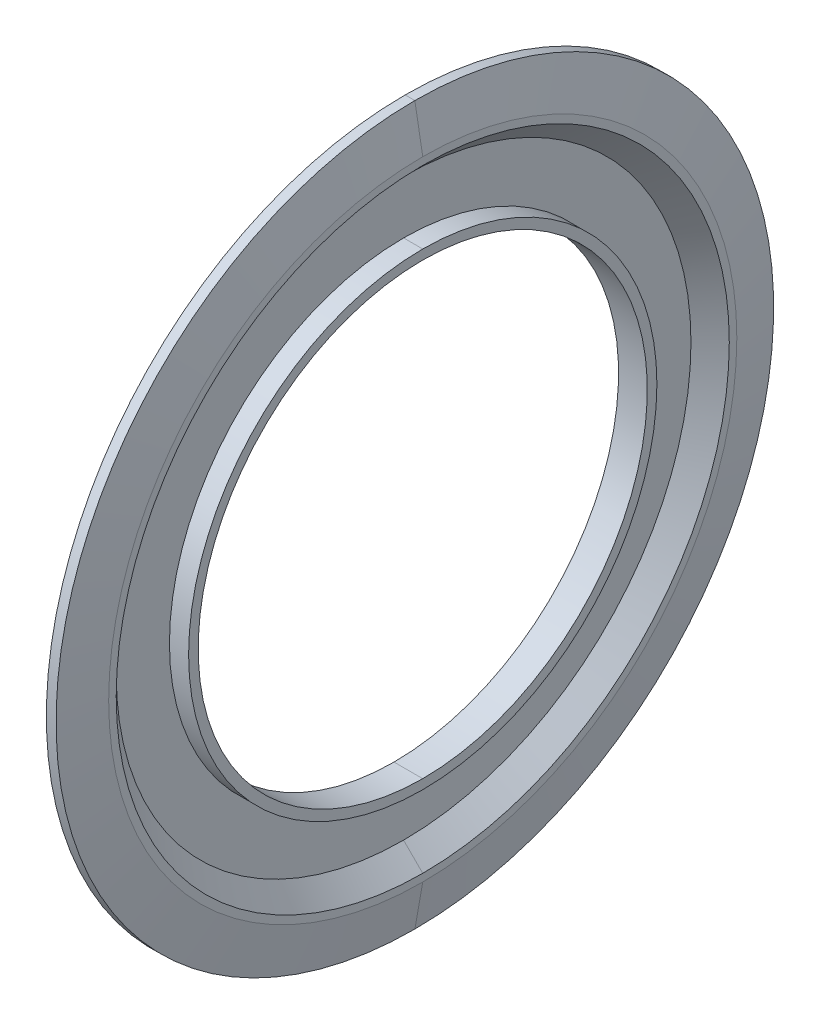
ISO-10303-21;
HEADER;
FILE_DESCRIPTION(('STEP AP214'),'2;1');
FILE_NAME('part.step','',(''),(''),'','','');
FILE_SCHEMA(('AUTOMOTIVE_DESIGN { 1 0 10303 214 1 1 1 1 }'));
ENDSEC;
DATA;
#1=APPLICATION_CONTEXT('core data for automotive mechanical design processes');
#2=APPLICATION_PROTOCOL_DEFINITION('international standard','automotive_design',2000,#1);
#3=PRODUCT_CONTEXT('',#1,'mechanical');
#4=PRODUCT('Part','Part','',(#3));
#5=PRODUCT_RELATED_PRODUCT_CATEGORY('part','',(#4));
#6=PRODUCT_DEFINITION_FORMATION('','',#4);
#7=PRODUCT_DEFINITION_CONTEXT('part definition',#1,'design');
#8=PRODUCT_DEFINITION('design','',#6,#7);
#9=PRODUCT_DEFINITION_SHAPE('','',#8);
#10=(LENGTH_UNIT() NAMED_UNIT(*) SI_UNIT(.MILLI.,.METRE.));
#11=(NAMED_UNIT(*) PLANE_ANGLE_UNIT() SI_UNIT($,.RADIAN.));
#12=(NAMED_UNIT(*) SI_UNIT($,.STERADIAN.) SOLID_ANGLE_UNIT());
#13=UNCERTAINTY_MEASURE_WITH_UNIT(LENGTH_MEASURE(1.E-05),#10,'distance_accuracy_value','');
#14=(GEOMETRIC_REPRESENTATION_CONTEXT(3) GLOBAL_UNCERTAINTY_ASSIGNED_CONTEXT((#13)) GLOBAL_UNIT_ASSIGNED_CONTEXT((#10,
#11,#12)) REPRESENTATION_CONTEXT('',''));
#15=CARTESIAN_POINT('',(0.,0.,0.));
#16=DIRECTION('',(0.,0.,1.));
#17=DIRECTION('',(1.,0.,0.));
#18=AXIS2_PLACEMENT_3D('',#15,#16,#17);
#19=CARTESIAN_POINT('',(0.715925388376828,5.928,0.));
#20=DIRECTION('',(1.,0.,0.));
#21=DIRECTION('',(0.,0.,1.));
#22=AXIS2_PLACEMENT_3D('',#19,#20,#21);
#23=PLANE('',#22);
#24=CARTESIAN_POINT('',(0.715925388376828,0.,0.));
#25=DIRECTION('',(-1.,0.,0.));
#26=DIRECTION('',(0.,1.,0.));
#27=AXIS2_PLACEMENT_3D('',#24,#25,#26);
#28=CIRCLE('',#27,5.856);
#29=CARTESIAN_POINT('',(0.715925388376828,5.856,0.));
#30=VERTEX_POINT('',#29);
#31=CARTESIAN_POINT('',(0.715925388376828,-5.856,0.));
#32=VERTEX_POINT('',#31);
#33=EDGE_CURVE('E11',#30,#32,#28,.T.);
#34=ORIENTED_EDGE('',*,*,#33,.T.);
#35=CARTESIAN_POINT('',(0.715925388376828,0.,0.));
#36=DIRECTION('',(-1.,0.,0.));
#37=DIRECTION('',(0.,1.,0.));
#38=AXIS2_PLACEMENT_3D('',#35,#36,#37);
#39=CIRCLE('',#38,5.856);
#40=EDGE_CURVE('E110',#32,#30,#39,.T.);
#41=ORIENTED_EDGE('',*,*,#40,.T.);
#42=EDGE_LOOP('',(#34,#41));
#43=FACE_BOUND('',#42,.T.);
#44=CARTESIAN_POINT('',(0.715925388376828,0.,0.));
#45=DIRECTION('',(-1.,0.,0.));
#46=DIRECTION('',(0.,1.,0.));
#47=AXIS2_PLACEMENT_3D('',#44,#45,#46);
#48=CIRCLE('',#47,6.);
#49=CARTESIAN_POINT('',(0.715925388376828,6.,0.));
#50=VERTEX_POINT('',#49);
#51=CARTESIAN_POINT('',(0.715925388376828,-6.,0.));
#52=VERTEX_POINT('',#51);
#53=EDGE_CURVE('E188',#50,#52,#48,.T.);
#54=ORIENTED_EDGE('',*,*,#53,.F.);
#55=CARTESIAN_POINT('',(0.715925388376828,0.,0.));
#56=DIRECTION('',(-1.,0.,0.));
#57=DIRECTION('',(0.,1.,0.));
#58=AXIS2_PLACEMENT_3D('',#55,#56,#57);
#59=CIRCLE('',#58,6.);
#60=EDGE_CURVE('E30',#52,#50,#59,.T.);
#61=ORIENTED_EDGE('',*,*,#60,.F.);
#62=EDGE_LOOP('',(#54,#61));
#63=FACE_BOUND('',#62,.T.);
#64=ADVANCED_FACE('F16',(#43,#63),#23,.T.);
#65=CARTESIAN_POINT('',(0.532925388376828,0.,0.));
#66=DIRECTION('',(1.,0.,0.));
#67=DIRECTION('',(0.,1.,0.));
#68=AXIS2_PLACEMENT_3D('',#65,#66,#67);
#69=CONICAL_SURFACE('',#68,5.673,0.785398163397448);
#70=DIRECTION('',(-0.707106781186548,-0.707106781186547,0.));
#71=VECTOR('',#70,1.);
#72=CARTESIAN_POINT('',(0.532925388376828,5.673,0.));
#73=LINE('',#72,#71);
#74=CARTESIAN_POINT('',(0.349925388376828,5.49,0.));
#75=VERTEX_POINT('',#74);
#76=EDGE_CURVE('E105',#30,#75,#73,.T.);
#77=ORIENTED_EDGE('',*,*,#76,.T.);
#78=CARTESIAN_POINT('',(0.349925388376828,0.,0.));
#79=DIRECTION('',(-1.,0.,0.));
#80=DIRECTION('',(0.,1.,0.));
#81=AXIS2_PLACEMENT_3D('',#78,#79,#80);
#82=CIRCLE('',#81,5.49);
#83=CARTESIAN_POINT('',(0.349925388376828,-5.49,0.));
#84=VERTEX_POINT('',#83);
#85=EDGE_CURVE('E19',#75,#84,#82,.T.);
#86=ORIENTED_EDGE('',*,*,#85,.T.);
#87=DIRECTION('',(0.707106781186548,-0.707106781186547,0.));
#88=VECTOR('',#87,1.);
#89=CARTESIAN_POINT('',(0.532925388376828,-5.673,0.));
#90=LINE('',#89,#88);
#91=EDGE_CURVE('E107',#84,#32,#90,.T.);
#92=ORIENTED_EDGE('',*,*,#91,.T.);
#93=ORIENTED_EDGE('',*,*,#33,.F.);
#94=EDGE_LOOP('',(#77,#86,#92,#93));
#95=FACE_BOUND('',#94,.T.);
#96=ADVANCED_FACE('F103',(#95),#69,.F.);
#97=CARTESIAN_POINT('',(0.349925388376828,4.9815,0.));
#98=DIRECTION('',(1.,0.,0.));
#99=DIRECTION('',(0.,-1.,0.));
#100=AXIS2_PLACEMENT_3D('',#97,#98,#99);
#101=PLANE('',#100);
#102=CARTESIAN_POINT('',(0.349925388376827,0.,0.));
#103=DIRECTION('',(-1.,0.,0.));
#104=DIRECTION('',(0.,1.,0.));
#105=AXIS2_PLACEMENT_3D('',#102,#103,#104);
#106=CIRCLE('',#105,4.473);
#107=CARTESIAN_POINT('',(0.349925388376827,4.473,0.));
#108=VERTEX_POINT('',#107);
#109=CARTESIAN_POINT('',(0.349925388376827,-4.473,0.));
#110=VERTEX_POINT('',#109);
#111=EDGE_CURVE('E149',#108,#110,#106,.T.);
#112=ORIENTED_EDGE('',*,*,#111,.T.);
#113=CARTESIAN_POINT('',(0.349925388376827,0.,0.));
#114=DIRECTION('',(-1.,0.,0.));
#115=DIRECTION('',(0.,1.,0.));
#116=AXIS2_PLACEMENT_3D('',#113,#114,#115);
#117=CIRCLE('',#116,4.473);
#118=EDGE_CURVE('E201',#110,#108,#117,.T.);
#119=ORIENTED_EDGE('',*,*,#118,.T.);
#120=EDGE_LOOP('',(#112,#119));
#121=FACE_BOUND('',#120,.T.);
#122=ORIENTED_EDGE('',*,*,#85,.F.);
#123=CARTESIAN_POINT('',(0.349925388376828,0.,0.));
#124=DIRECTION('',(-1.,0.,0.));
#125=DIRECTION('',(0.,1.,0.));
#126=AXIS2_PLACEMENT_3D('',#123,#124,#125);
#127=CIRCLE('',#126,5.49);
#128=EDGE_CURVE('E116',#84,#75,#127,.T.);
#129=ORIENTED_EDGE('',*,*,#128,.F.);
#130=EDGE_LOOP('',(#122,#129));
#131=FACE_BOUND('',#130,.T.);
#132=ADVANCED_FACE('F205',(#121,#131),#101,.T.);
#133=CARTESIAN_POINT('',(0.532925388376828,0.,0.));
#134=DIRECTION('',(-1.,0.,0.));
#135=DIRECTION('',(0.,1.,0.));
#136=AXIS2_PLACEMENT_3D('',#133,#134,#135);
#137=CYLINDRICAL_SURFACE('',#136,4.473);
#138=DIRECTION('',(-1.,0.,0.));
#139=VECTOR('',#138,1.);
#140=CARTESIAN_POINT('',(0.532925388376828,4.473,0.));
#141=LINE('',#140,#139);
#142=CARTESIAN_POINT('',(0.715925388376828,4.473,0.));
#143=VERTEX_POINT('',#142);
#144=EDGE_CURVE('E129',#143,#108,#141,.T.);
#145=ORIENTED_EDGE('',*,*,#144,.T.);
#146=ORIENTED_EDGE('',*,*,#118,.F.);
#147=DIRECTION('',(1.,0.,0.));
#148=VECTOR('',#147,1.);
#149=CARTESIAN_POINT('',(0.532925388376828,-4.473,0.));
#150=LINE('',#149,#148);
#151=CARTESIAN_POINT('',(0.715925388376828,-4.473,0.));
#152=VERTEX_POINT('',#151);
#153=EDGE_CURVE('E141',#110,#152,#150,.T.);
#154=ORIENTED_EDGE('',*,*,#153,.T.);
#155=CARTESIAN_POINT('',(0.715925388376828,0.,0.));
#156=DIRECTION('',(-1.,0.,0.));
#157=DIRECTION('',(0.,1.,0.));
#158=AXIS2_PLACEMENT_3D('',#155,#156,#157);
#159=CIRCLE('',#158,4.473);
#160=EDGE_CURVE('E138',#152,#143,#159,.T.);
#161=ORIENTED_EDGE('',*,*,#160,.T.);
#162=EDGE_LOOP('',(#145,#146,#154,#161));
#163=FACE_BOUND('',#162,.T.);
#164=ADVANCED_FACE('F207',(#163),#137,.T.);
#165=CARTESIAN_POINT('',(0.715925388376828,4.3815,0.));
#166=DIRECTION('',(1.,0.,0.));
#167=DIRECTION('',(0.,0.,1.));
#168=AXIS2_PLACEMENT_3D('',#165,#166,#167);
#169=PLANE('',#168);
#170=CARTESIAN_POINT('',(0.715925388376828,0.,0.));
#171=DIRECTION('',(-1.,0.,0.));
#172=DIRECTION('',(0.,1.,0.));
#173=AXIS2_PLACEMENT_3D('',#170,#171,#172);
#174=CIRCLE('',#173,4.29);
#175=CARTESIAN_POINT('',(0.715925388376828,4.29,0.));
#176=VERTEX_POINT('',#175);
#177=CARTESIAN_POINT('',(0.715925388376828,-4.29,0.));
#178=VERTEX_POINT('',#177);
#179=EDGE_CURVE('E132',#176,#178,#174,.T.);
#180=ORIENTED_EDGE('',*,*,#179,.T.);
#181=CARTESIAN_POINT('',(0.715925388376828,0.,0.));
#182=DIRECTION('',(-1.,0.,0.));
#183=DIRECTION('',(0.,1.,0.));
#184=AXIS2_PLACEMENT_3D('',#181,#182,#183);
#185=CIRCLE('',#184,4.29);
#186=EDGE_CURVE('E119',#178,#176,#185,.T.);
#187=ORIENTED_EDGE('',*,*,#186,.T.);
#188=EDGE_LOOP('',(#180,#187));
#189=FACE_BOUND('',#188,.T.);
#190=CARTESIAN_POINT('',(0.715925388376828,0.,0.));
#191=DIRECTION('',(-1.,0.,0.));
#192=DIRECTION('',(0.,1.,0.));
#193=AXIS2_PLACEMENT_3D('',#190,#191,#192);
#194=CIRCLE('',#193,4.473);
#195=EDGE_CURVE('E136',#143,#152,#194,.T.);
#196=ORIENTED_EDGE('',*,*,#195,.F.);
#197=ORIENTED_EDGE('',*,*,#160,.F.);
#198=EDGE_LOOP('',(#196,#197));
#199=FACE_BOUND('',#198,.T.);
#200=ADVANCED_FACE('F214',(#189,#199),#169,.T.);
#201=CARTESIAN_POINT('',(0.441425388376828,0.,0.));
#202=DIRECTION('',(-1.,0.,0.));
#203=DIRECTION('',(0.,1.,0.));
#204=AXIS2_PLACEMENT_3D('',#201,#202,#203);
#205=CYLINDRICAL_SURFACE('',#204,4.29);
#206=DIRECTION('',(-1.,0.,0.));
#207=VECTOR('',#206,1.);
#208=CARTESIAN_POINT('',(0.441425388376828,4.29,0.));
#209=LINE('',#208,#207);
#210=CARTESIAN_POINT('',(0.166925388376828,4.29,0.));
#211=VERTEX_POINT('',#210);
#212=EDGE_CURVE('E123',#176,#211,#209,.T.);
#213=ORIENTED_EDGE('',*,*,#212,.T.);
#214=CARTESIAN_POINT('',(0.166925388376828,0.,0.));
#215=DIRECTION('',(-1.,0.,0.));
#216=DIRECTION('',(0.,1.,0.));
#217=AXIS2_PLACEMENT_3D('',#214,#215,#216);
#218=CIRCLE('',#217,4.29);
#219=CARTESIAN_POINT('',(0.166925388376828,-4.29,0.));
#220=VERTEX_POINT('',#219);
#221=EDGE_CURVE('E130',#211,#220,#218,.T.);
#222=ORIENTED_EDGE('',*,*,#221,.T.);
#223=DIRECTION('',(1.,0.,0.));
#224=VECTOR('',#223,1.);
#225=CARTESIAN_POINT('',(0.441425388376828,-4.29,0.));
#226=LINE('',#225,#224);
#227=EDGE_CURVE('E122',#220,#178,#226,.T.);
#228=ORIENTED_EDGE('',*,*,#227,.T.);
#229=ORIENTED_EDGE('',*,*,#179,.F.);
#230=EDGE_LOOP('',(#213,#222,#228,#229));
#231=FACE_BOUND('',#230,.T.);
#232=ADVANCED_FACE('F249',(#231),#205,.F.);
#233=CARTESIAN_POINT('',(0.166925388376828,4.92790054095714,0.));
#234=DIRECTION('',(-1.,0.,0.));
#235=DIRECTION('',(0.,0.,1.));
#236=AXIS2_PLACEMENT_3D('',#233,#234,#235);
#237=PLANE('',#236);
#238=ORIENTED_EDGE('',*,*,#221,.F.);
#239=CARTESIAN_POINT('',(0.166925388376828,0.,0.));
#240=DIRECTION('',(-1.,0.,0.));
#241=DIRECTION('',(0.,1.,0.));
#242=AXIS2_PLACEMENT_3D('',#239,#240,#241);
#243=CIRCLE('',#242,4.29);
#244=EDGE_CURVE('E127',#220,#211,#243,.T.);
#245=ORIENTED_EDGE('',*,*,#244,.F.);
#246=EDGE_LOOP('',(#238,#245));
#247=FACE_BOUND('',#246,.T.);
#248=CARTESIAN_POINT('',(0.166925388376828,0.,0.));
#249=DIRECTION('',(-1.,0.,0.));
#250=DIRECTION('',(0.,1.,0.));
#251=AXIS2_PLACEMENT_3D('',#248,#249,#250);
#252=CIRCLE('',#251,5.56580108191428);
#253=CARTESIAN_POINT('',(0.166925388376828,5.56580108191428,0.));
#254=VERTEX_POINT('',#253);
#255=CARTESIAN_POINT('',(0.166925388376828,-5.56580108191428,0.));
#256=VERTEX_POINT('',#255);
#257=EDGE_CURVE('E152',#254,#256,#252,.T.);
#258=ORIENTED_EDGE('',*,*,#257,.T.);
#259=CARTESIAN_POINT('',(0.166925388376828,0.,0.));
#260=DIRECTION('',(-1.,0.,0.));
#261=DIRECTION('',(0.,1.,0.));
#262=AXIS2_PLACEMENT_3D('',#259,#260,#261);
#263=CIRCLE('',#262,5.56580108191428);
#264=EDGE_CURVE('E133',#256,#254,#263,.T.);
#265=ORIENTED_EDGE('',*,*,#264,.T.);
#266=EDGE_LOOP('',(#258,#265));
#267=FACE_BOUND('',#266,.T.);
#268=ADVANCED_FACE('F259',(#247,#267),#237,.T.);
#269=CARTESIAN_POINT('',(0.349925388376828,0.,0.));
#270=DIRECTION('',(1.,0.,0.));
#271=DIRECTION('',(0.,1.,0.));
#272=AXIS2_PLACEMENT_3D('',#269,#270,#271);
#273=CONICAL_SURFACE('',#272,5.74880108191428,0.785398163397448);
#274=DIRECTION('',(-0.707106781186548,-0.707106781186547,0.));
#275=VECTOR('',#274,1.);
#276=CARTESIAN_POINT('',(0.349925388376828,5.74880108191428,0.));
#277=LINE('',#276,#275);
#278=CARTESIAN_POINT('',(0.532925388376828,5.93180108191428,0.));
#279=VERTEX_POINT('',#278);
#280=EDGE_CURVE('E146',#279,#254,#277,.T.);
#281=ORIENTED_EDGE('',*,*,#280,.T.);
#282=ORIENTED_EDGE('',*,*,#264,.F.);
#283=DIRECTION('',(0.707106781186548,-0.707106781186547,0.));
#284=VECTOR('',#283,1.);
#285=CARTESIAN_POINT('',(0.349925388376828,-5.74880108191428,0.));
#286=LINE('',#285,#284);
#287=CARTESIAN_POINT('',(0.532925388376828,-5.93180108191428,0.));
#288=VERTEX_POINT('',#287);
#289=EDGE_CURVE('E145',#256,#288,#286,.T.);
#290=ORIENTED_EDGE('',*,*,#289,.T.);
#291=CARTESIAN_POINT('',(0.532925388376828,0.,0.));
#292=DIRECTION('',(-1.,0.,0.));
#293=DIRECTION('',(0.,1.,0.));
#294=AXIS2_PLACEMENT_3D('',#291,#292,#293);
#295=CIRCLE('',#294,5.93180108191428);
#296=EDGE_CURVE('E198',#288,#279,#295,.T.);
#297=ORIENTED_EDGE('',*,*,#296,.T.);
#298=EDGE_LOOP('',(#281,#282,#290,#297));
#299=FACE_BOUND('',#298,.T.);
#300=ADVANCED_FACE('F269',(#299),#273,.T.);
#301=CARTESIAN_POINT('',(0.532925388376828,5.95789532824452,0.));
#302=DIRECTION('',(-1.,0.,0.));
#303=DIRECTION('',(0.,0.,1.));
#304=AXIS2_PLACEMENT_3D('',#301,#302,#303);
#305=PLANE('',#304);
#306=CARTESIAN_POINT('',(0.532925388376828,0.,0.));
#307=DIRECTION('',(-1.,0.,0.));
#308=DIRECTION('',(0.,1.,0.));
#309=AXIS2_PLACEMENT_3D('',#306,#307,#308);
#310=CIRCLE('',#309,5.93180108191428);
#311=EDGE_CURVE('E142',#279,#288,#310,.T.);
#312=ORIENTED_EDGE('',*,*,#311,.F.);
#313=ORIENTED_EDGE('',*,*,#296,.F.);
#314=EDGE_LOOP('',(#312,#313));
#315=FACE_BOUND('',#314,.T.);
#316=CARTESIAN_POINT('',(0.532925388376828,0.,0.));
#317=DIRECTION('',(-1.,0.,0.));
#318=DIRECTION('',(0.,1.,0.));
#319=AXIS2_PLACEMENT_3D('',#316,#317,#318);
#320=CIRCLE('',#319,5.98398957457476);
#321=CARTESIAN_POINT('',(0.532925388376828,5.98398957457476,0.));
#322=VERTEX_POINT('',#321);
#323=CARTESIAN_POINT('',(0.532925388376828,-5.98398957457476,0.));
#324=VERTEX_POINT('',#323);
#325=EDGE_CURVE('E196',#322,#324,#320,.T.);
#326=ORIENTED_EDGE('',*,*,#325,.T.);
#327=CARTESIAN_POINT('',(0.532925388376828,0.,0.));
#328=DIRECTION('',(-1.,0.,0.));
#329=DIRECTION('',(0.,1.,0.));
#330=AXIS2_PLACEMENT_3D('',#327,#328,#329);
#331=CIRCLE('',#330,5.98398957457476);
#332=EDGE_CURVE('E166',#324,#322,#331,.T.);
#333=ORIENTED_EDGE('',*,*,#332,.T.);
#334=EDGE_LOOP('',(#326,#333));
#335=FACE_BOUND('',#334,.T.);
#336=ADVANCED_FACE('F279',(#315,#335),#305,.T.);
#337=CARTESIAN_POINT('',(0.456222232626768,0.,0.));
#338=DIRECTION('',(-1.,0.,0.));
#339=DIRECTION('',(0.,1.,0.));
#340=AXIS2_PLACEMENT_3D('',#337,#338,#339);
#341=CONICAL_SURFACE('',#340,6.41899478728738,1.39626340159546);
#342=DIRECTION('',(-0.17364817766693,0.984807753012208,0.));
#343=VECTOR('',#342,1.);
#344=CARTESIAN_POINT('',(0.456222232626768,6.41899478728738,0.));
#345=LINE('',#344,#343);
#346=CARTESIAN_POINT('',(0.379519076876707,6.854,0.));
#347=VERTEX_POINT('',#346);
#348=EDGE_CURVE('E163',#322,#347,#345,.T.);
#349=ORIENTED_EDGE('',*,*,#348,.T.);
#350=CARTESIAN_POINT('',(0.379519076876707,0.,0.));
#351=DIRECTION('',(-1.,0.,0.));
#352=DIRECTION('',(0.,1.,0.));
#353=AXIS2_PLACEMENT_3D('',#350,#351,#352);
#354=CIRCLE('',#353,6.854);
#355=CARTESIAN_POINT('',(0.379519076876707,-6.854,0.));
#356=VERTEX_POINT('',#355);
#357=EDGE_CURVE('E184',#347,#356,#354,.T.);
#358=ORIENTED_EDGE('',*,*,#357,.T.);
#359=DIRECTION('',(0.17364817766693,0.984807753012208,0.));
#360=VECTOR('',#359,1.);
#361=CARTESIAN_POINT('',(0.456222232626768,-6.41899478728738,0.));
#362=LINE('',#361,#360);
#363=EDGE_CURVE('E169',#356,#324,#362,.T.);
#364=ORIENTED_EDGE('',*,*,#363,.T.);
#365=ORIENTED_EDGE('',*,*,#325,.F.);
#366=EDGE_LOOP('',(#349,#358,#364,#365));
#367=FACE_BOUND('',#366,.T.);
#368=ADVANCED_FACE('F288',(#367),#341,.F.);
#369=CARTESIAN_POINT('',(0.472430611864253,0.,0.));
#370=DIRECTION('',(-1.,0.,0.));
#371=DIRECTION('',(0.,1.,0.));
#372=AXIS2_PLACEMENT_3D('',#369,#370,#371);
#373=CYLINDRICAL_SURFACE('',#372,6.854);
#374=DIRECTION('',(-1.,0.,0.));
#375=VECTOR('',#374,1.);
#376=CARTESIAN_POINT('',(0.472430611864253,6.854,0.));
#377=LINE('',#376,#375);
#378=CARTESIAN_POINT('',(0.565342146851799,6.854,0.));
#379=VERTEX_POINT('',#378);
#380=EDGE_CURVE('E175',#379,#347,#377,.T.);
#381=ORIENTED_EDGE('',*,*,#380,.T.);
#382=CARTESIAN_POINT('',(0.379519076876707,0.,0.));
#383=DIRECTION('',(-1.,0.,0.));
#384=DIRECTION('',(0.,1.,0.));
#385=AXIS2_PLACEMENT_3D('',#382,#383,#384);
#386=CIRCLE('',#385,6.854);
#387=EDGE_CURVE('E172',#356,#347,#386,.T.);
#388=ORIENTED_EDGE('',*,*,#387,.F.);
#389=DIRECTION('',(1.,0.,0.));
#390=VECTOR('',#389,1.);
#391=CARTESIAN_POINT('',(0.472430611864253,-6.854,0.));
#392=LINE('',#391,#390);
#393=CARTESIAN_POINT('',(0.565342146851799,-6.854,0.));
#394=VERTEX_POINT('',#393);
#395=EDGE_CURVE('E181',#356,#394,#392,.T.);
#396=ORIENTED_EDGE('',*,*,#395,.T.);
#397=CARTESIAN_POINT('',(0.565342146851799,0.,0.));
#398=DIRECTION('',(-1.,0.,0.));
#399=DIRECTION('',(0.,1.,0.));
#400=AXIS2_PLACEMENT_3D('',#397,#398,#399);
#401=CIRCLE('',#400,6.854);
#402=EDGE_CURVE('E193',#394,#379,#401,.T.);
#403=ORIENTED_EDGE('',*,*,#402,.T.);
#404=EDGE_LOOP('',(#381,#388,#396,#403));
#405=FACE_BOUND('',#404,.T.);
#406=ADVANCED_FACE('F298',(#405),#373,.T.);
#407=CARTESIAN_POINT('',(0.640633767614314,0.,0.));
#408=DIRECTION('',(-1.,0.,0.));
#409=DIRECTION('',(0.,1.,0.));
#410=AXIS2_PLACEMENT_3D('',#407,#408,#409);
#411=CONICAL_SURFACE('',#410,6.427,1.39626340159546);
#412=DIRECTION('',(-0.17364817766693,0.984807753012208,0.));
#413=VECTOR('',#412,1.);
#414=CARTESIAN_POINT('',(0.640633767614314,6.427,0.));
#415=LINE('',#414,#413);
#416=EDGE_CURVE('E186',#50,#379,#415,.T.);
#417=ORIENTED_EDGE('',*,*,#416,.T.);
#418=ORIENTED_EDGE('',*,*,#402,.F.);
#419=DIRECTION('',(0.17364817766693,0.984807753012208,0.));
#420=VECTOR('',#419,1.);
#421=CARTESIAN_POINT('',(0.640633767614314,-6.427,0.));
#422=LINE('',#421,#420);
#423=EDGE_CURVE('E191',#394,#52,#422,.T.);
#424=ORIENTED_EDGE('',*,*,#423,.T.);
#425=ORIENTED_EDGE('',*,*,#60,.T.);
#426=EDGE_LOOP('',(#417,#418,#424,#425));
#427=FACE_BOUND('',#426,.T.);
#428=ADVANCED_FACE('F308',(#427),#411,.T.);
#429=CARTESIAN_POINT('',(0.640633767614314,0.,0.));
#430=DIRECTION('',(-1.,0.,0.));
#431=DIRECTION('',(0.,1.,0.));
#432=AXIS2_PLACEMENT_3D('',#429,#430,#431);
#433=CONICAL_SURFACE('',#432,6.427,1.39626340159546);
#434=ORIENTED_EDGE('',*,*,#416,.F.);
#435=ORIENTED_EDGE('',*,*,#53,.T.);
#436=ORIENTED_EDGE('',*,*,#423,.F.);
#437=CARTESIAN_POINT('',(0.565342146851799,0.,0.));
#438=DIRECTION('',(-1.,0.,0.));
#439=DIRECTION('',(0.,1.,0.));
#440=AXIS2_PLACEMENT_3D('',#437,#438,#439);
#441=CIRCLE('',#440,6.854);
#442=EDGE_CURVE('E178',#379,#394,#441,.T.);
#443=ORIENTED_EDGE('',*,*,#442,.F.);
#444=EDGE_LOOP('',(#434,#435,#436,#443));
#445=FACE_BOUND('',#444,.T.);
#446=ADVANCED_FACE('F318',(#445),#433,.T.);
#447=CARTESIAN_POINT('',(0.472430611864253,0.,0.));
#448=DIRECTION('',(-1.,0.,0.));
#449=DIRECTION('',(0.,1.,0.));
#450=AXIS2_PLACEMENT_3D('',#447,#448,#449);
#451=CYLINDRICAL_SURFACE('',#450,6.854);
#452=ORIENTED_EDGE('',*,*,#380,.F.);
#453=ORIENTED_EDGE('',*,*,#442,.T.);
#454=ORIENTED_EDGE('',*,*,#395,.F.);
#455=ORIENTED_EDGE('',*,*,#357,.F.);
#456=EDGE_LOOP('',(#452,#453,#454,#455));
#457=FACE_BOUND('',#456,.T.);
#458=ADVANCED_FACE('F327',(#457),#451,.T.);
#459=CARTESIAN_POINT('',(0.456222232626768,0.,0.));
#460=DIRECTION('',(-1.,0.,0.));
#461=DIRECTION('',(0.,1.,0.));
#462=AXIS2_PLACEMENT_3D('',#459,#460,#461);
#463=CONICAL_SURFACE('',#462,6.41899478728738,1.39626340159546);
#464=ORIENTED_EDGE('',*,*,#348,.F.);
#465=ORIENTED_EDGE('',*,*,#332,.F.);
#466=ORIENTED_EDGE('',*,*,#363,.F.);
#467=ORIENTED_EDGE('',*,*,#387,.T.);
#468=EDGE_LOOP('',(#464,#465,#466,#467));
#469=FACE_BOUND('',#468,.T.);
#470=ADVANCED_FACE('F337',(#469),#463,.F.);
#471=CARTESIAN_POINT('',(0.349925388376828,0.,0.));
#472=DIRECTION('',(1.,0.,0.));
#473=DIRECTION('',(0.,1.,0.));
#474=AXIS2_PLACEMENT_3D('',#471,#472,#473);
#475=CONICAL_SURFACE('',#474,5.74880108191428,0.785398163397448);
#476=ORIENTED_EDGE('',*,*,#280,.F.);
#477=ORIENTED_EDGE('',*,*,#311,.T.);
#478=ORIENTED_EDGE('',*,*,#289,.F.);
#479=ORIENTED_EDGE('',*,*,#257,.F.);
#480=EDGE_LOOP('',(#476,#477,#478,#479));
#481=FACE_BOUND('',#480,.T.);
#482=ADVANCED_FACE('F347',(#481),#475,.T.);
#483=CARTESIAN_POINT('',(0.441425388376828,0.,0.));
#484=DIRECTION('',(-1.,0.,0.));
#485=DIRECTION('',(0.,1.,0.));
#486=AXIS2_PLACEMENT_3D('',#483,#484,#485);
#487=CYLINDRICAL_SURFACE('',#486,4.29);
#488=ORIENTED_EDGE('',*,*,#212,.F.);
#489=ORIENTED_EDGE('',*,*,#186,.F.);
#490=ORIENTED_EDGE('',*,*,#227,.F.);
#491=ORIENTED_EDGE('',*,*,#244,.T.);
#492=EDGE_LOOP('',(#488,#489,#490,#491));
#493=FACE_BOUND('',#492,.T.);
#494=ADVANCED_FACE('F357',(#493),#487,.F.);
#495=CARTESIAN_POINT('',(0.532925388376828,0.,0.));
#496=DIRECTION('',(-1.,0.,0.));
#497=DIRECTION('',(0.,1.,0.));
#498=AXIS2_PLACEMENT_3D('',#495,#496,#497);
#499=CYLINDRICAL_SURFACE('',#498,4.473);
#500=ORIENTED_EDGE('',*,*,#144,.F.);
#501=ORIENTED_EDGE('',*,*,#195,.T.);
#502=ORIENTED_EDGE('',*,*,#153,.F.);
#503=ORIENTED_EDGE('',*,*,#111,.F.);
#504=EDGE_LOOP('',(#500,#501,#502,#503));
#505=FACE_BOUND('',#504,.T.);
#506=ADVANCED_FACE('F367',(#505),#499,.T.);
#507=CARTESIAN_POINT('',(0.532925388376828,0.,0.));
#508=DIRECTION('',(1.,0.,0.));
#509=DIRECTION('',(0.,1.,0.));
#510=AXIS2_PLACEMENT_3D('',#507,#508,#509);
#511=CONICAL_SURFACE('',#510,5.673,0.785398163397448);
#512=ORIENTED_EDGE('',*,*,#76,.F.);
#513=ORIENTED_EDGE('',*,*,#40,.F.);
#514=ORIENTED_EDGE('',*,*,#91,.F.);
#515=ORIENTED_EDGE('',*,*,#128,.T.);
#516=EDGE_LOOP('',(#512,#513,#514,#515));
#517=FACE_BOUND('',#516,.T.);
#518=ADVANCED_FACE('F114',(#517),#511,.F.);
#519=CLOSED_SHELL('',(#64,#96,#132,#164,#200,#232,#268,#300,#336,#368,#406,#428,#446,#458,#470,
#482,#494,#506,#518));
#520=MANIFOLD_SOLID_BREP('B1',#519);
#521=ADVANCED_BREP_SHAPE_REPRESENTATION('',(#18,#520),#14);
#522=SHAPE_DEFINITION_REPRESENTATION(#9,#521);
ENDSEC;
END-ISO-10303-21;
